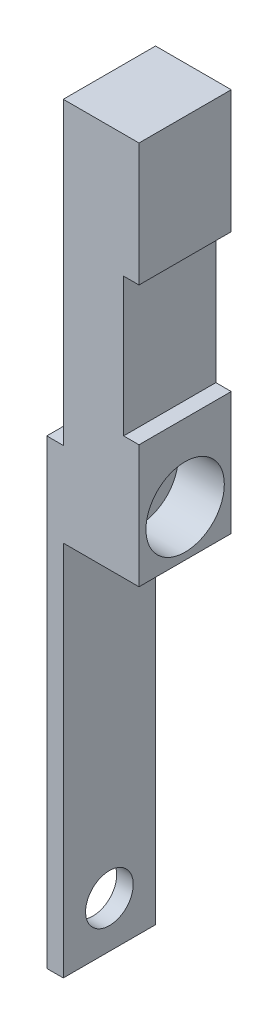
ISO-10303-21;
HEADER;
FILE_DESCRIPTION(('STEP AP214'),'2;1');
FILE_NAME('part.step','',(''),(''),'','','');
FILE_SCHEMA(('AUTOMOTIVE_DESIGN { 1 0 10303 214 1 1 1 1 }'));
ENDSEC;
DATA;
#1=APPLICATION_CONTEXT('core data for automotive mechanical design processes');
#2=APPLICATION_PROTOCOL_DEFINITION('international standard','automotive_design',2000,#1);
#3=PRODUCT_CONTEXT('',#1,'mechanical');
#4=PRODUCT('Part','Part','',(#3));
#5=PRODUCT_RELATED_PRODUCT_CATEGORY('part','',(#4));
#6=PRODUCT_DEFINITION_FORMATION('','',#4);
#7=PRODUCT_DEFINITION_CONTEXT('part definition',#1,'design');
#8=PRODUCT_DEFINITION('design','',#6,#7);
#9=PRODUCT_DEFINITION_SHAPE('','',#8);
#10=(LENGTH_UNIT() NAMED_UNIT(*) SI_UNIT(.MILLI.,.METRE.));
#11=(NAMED_UNIT(*) PLANE_ANGLE_UNIT() SI_UNIT($,.RADIAN.));
#12=(NAMED_UNIT(*) SI_UNIT($,.STERADIAN.) SOLID_ANGLE_UNIT());
#13=UNCERTAINTY_MEASURE_WITH_UNIT(LENGTH_MEASURE(1.E-05),#10,'distance_accuracy_value','');
#14=(GEOMETRIC_REPRESENTATION_CONTEXT(3) GLOBAL_UNCERTAINTY_ASSIGNED_CONTEXT((#13)) GLOBAL_UNIT_ASSIGNED_CONTEXT((#10,
#11,#12)) REPRESENTATION_CONTEXT('',''));
#15=CARTESIAN_POINT('',(0.,0.,0.));
#16=DIRECTION('',(0.,0.,1.));
#17=DIRECTION('',(1.,0.,0.));
#18=AXIS2_PLACEMENT_3D('',#15,#16,#17);
#19=CARTESIAN_POINT('',(18.25,-26.,6.));
#20=DIRECTION('',(-1.,0.,0.));
#21=DIRECTION('',(0.,0.,1.));
#22=AXIS2_PLACEMENT_3D('',#19,#20,#21);
#23=PLANE('',#22);
#24=CARTESIAN_POINT('',(18.25,-20.,0.));
#25=DIRECTION('',(1.,0.,0.));
#26=DIRECTION('',(0.,0.,-1.));
#27=AXIS2_PLACEMENT_3D('',#24,#25,#26);
#28=CIRCLE('',#27,5.1);
#29=CARTESIAN_POINT('',(18.25,-20.,-5.1));
#30=VERTEX_POINT('',#29);
#31=EDGE_CURVE('E232',#30,#30,#28,.T.);
#32=ORIENTED_EDGE('',*,*,#31,.F.);
#33=EDGE_LOOP('',(#32));
#34=FACE_BOUND('',#33,.T.);
#35=DIRECTION('',(0.,1.,0.));
#36=VECTOR('',#35,1.);
#37=CARTESIAN_POINT('',(18.25,-26.,-6.));
#38=LINE('',#37,#36);
#39=CARTESIAN_POINT('',(18.25,-26.,-6.));
#40=VERTEX_POINT('',#39);
#41=CARTESIAN_POINT('',(18.25,-10.,-6.));
#42=VERTEX_POINT('',#41);
#43=EDGE_CURVE('E158',#40,#42,#38,.T.);
#44=ORIENTED_EDGE('',*,*,#43,.T.);
#45=DIRECTION('',(0.,0.,1.));
#46=VECTOR('',#45,1.);
#47=CARTESIAN_POINT('',(18.25,-10.,6.));
#48=LINE('',#47,#46);
#49=CARTESIAN_POINT('',(18.25,-10.,6.));
#50=VERTEX_POINT('',#49);
#51=EDGE_CURVE('E211',#42,#50,#48,.T.);
#52=ORIENTED_EDGE('',*,*,#51,.T.);
#53=DIRECTION('',(0.,1.,0.));
#54=VECTOR('',#53,1.);
#55=CARTESIAN_POINT('',(18.25,-26.,6.));
#56=LINE('',#55,#54);
#57=CARTESIAN_POINT('',(18.25,-26.,6.));
#58=VERTEX_POINT('',#57);
#59=EDGE_CURVE('E129',#58,#50,#56,.T.);
#60=ORIENTED_EDGE('',*,*,#59,.F.);
#61=DIRECTION('',(0.,0.,-1.));
#62=VECTOR('',#61,1.);
#63=CARTESIAN_POINT('',(18.25,-26.,6.));
#64=LINE('',#63,#62);
#65=EDGE_CURVE('E169',#58,#40,#64,.T.);
#66=ORIENTED_EDGE('',*,*,#65,.T.);
#67=EDGE_LOOP('',(#44,#52,#60,#66));
#68=FACE_BOUND('',#67,.T.);
#69=ADVANCED_FACE('F35',(#34,#68),#23,.F.);
#70=CARTESIAN_POINT('',(6.25,-15.,6.));
#71=DIRECTION('',(1.,0.,0.));
#72=DIRECTION('',(0.,1.,0.));
#73=AXIS2_PLACEMENT_3D('',#70,#71,#72);
#74=PLANE('',#73);
#75=CARTESIAN_POINT('',(6.25,-69.,0.));
#76=DIRECTION('',(1.,0.,0.));
#77=DIRECTION('',(0.,1.,0.));
#78=AXIS2_PLACEMENT_3D('',#75,#76,#77);
#79=CIRCLE('',#78,3.1);
#80=CARTESIAN_POINT('',(6.25,-65.9,0.));
#81=VERTEX_POINT('',#80);
#82=EDGE_CURVE('E219',#81,#81,#79,.T.);
#83=ORIENTED_EDGE('',*,*,#82,.T.);
#84=EDGE_LOOP('',(#83));
#85=FACE_BOUND('',#84,.T.);
#86=CARTESIAN_POINT('',(6.25,-20.,0.));
#87=DIRECTION('',(1.,0.,0.));
#88=DIRECTION('',(0.,0.,-1.));
#89=AXIS2_PLACEMENT_3D('',#86,#87,#88);
#90=CIRCLE('',#89,3.1);
#91=CARTESIAN_POINT('',(6.25,-20.,-3.1));
#92=VERTEX_POINT('',#91);
#93=EDGE_CURVE('E229',#92,#92,#90,.T.);
#94=ORIENTED_EDGE('',*,*,#93,.T.);
#95=EDGE_LOOP('',(#94));
#96=FACE_BOUND('',#95,.T.);
#97=DIRECTION('',(0.,-1.,0.));
#98=VECTOR('',#97,1.);
#99=CARTESIAN_POINT('',(6.25,-15.,-6.));
#100=LINE('',#99,#98);
#101=CARTESIAN_POINT('',(6.25,-15.,-6.));
#102=VERTEX_POINT('',#101);
#103=CARTESIAN_POINT('',(6.25000000000001,-75.,-6.));
#104=VERTEX_POINT('',#103);
#105=EDGE_CURVE('E147',#102,#104,#100,.T.);
#106=ORIENTED_EDGE('',*,*,#105,.T.);
#107=DIRECTION('',(0.,0.,-1.));
#108=VECTOR('',#107,1.);
#109=CARTESIAN_POINT('',(6.25000000000001,-75.,6.));
#110=LINE('',#109,#108);
#111=CARTESIAN_POINT('',(6.25000000000001,-75.,6.));
#112=VERTEX_POINT('',#111);
#113=EDGE_CURVE('E43',#112,#104,#110,.T.);
#114=ORIENTED_EDGE('',*,*,#113,.F.);
#115=DIRECTION('',(0.,-1.,0.));
#116=VECTOR('',#115,1.);
#117=CARTESIAN_POINT('',(6.25,-15.,6.));
#118=LINE('',#117,#116);
#119=CARTESIAN_POINT('',(6.25,-15.,6.));
#120=VERTEX_POINT('',#119);
#121=EDGE_CURVE('E165',#120,#112,#118,.T.);
#122=ORIENTED_EDGE('',*,*,#121,.F.);
#123=DIRECTION('',(0.,0.,-1.));
#124=VECTOR('',#123,1.);
#125=CARTESIAN_POINT('',(6.25,-15.,6.));
#126=LINE('',#125,#124);
#127=EDGE_CURVE('E143',#120,#102,#126,.T.);
#128=ORIENTED_EDGE('',*,*,#127,.T.);
#129=EDGE_LOOP('',(#106,#114,#122,#128));
#130=FACE_BOUND('',#129,.T.);
#131=ADVANCED_FACE('F37',(#85,#96,#130),#74,.F.);
#132=CARTESIAN_POINT('',(6.25000000000001,-75.,6.));
#133=DIRECTION('',(0.,1.,0.));
#134=DIRECTION('',(0.,0.,1.));
#135=AXIS2_PLACEMENT_3D('',#132,#133,#134);
#136=PLANE('',#135);
#137=DIRECTION('',(1.,0.,0.));
#138=VECTOR('',#137,1.);
#139=CARTESIAN_POINT('',(6.25000000000001,-75.,-6.));
#140=LINE('',#139,#138);
#141=CARTESIAN_POINT('',(8.40000000000001,-75.,-6.));
#142=VERTEX_POINT('',#141);
#143=EDGE_CURVE('E150',#104,#142,#140,.T.);
#144=ORIENTED_EDGE('',*,*,#143,.T.);
#145=DIRECTION('',(0.,0.,-1.));
#146=VECTOR('',#145,1.);
#147=CARTESIAN_POINT('',(8.40000000000001,-75.,6.));
#148=LINE('',#147,#146);
#149=CARTESIAN_POINT('',(8.40000000000001,-75.,6.));
#150=VERTEX_POINT('',#149);
#151=EDGE_CURVE('E175',#150,#142,#148,.T.);
#152=ORIENTED_EDGE('',*,*,#151,.F.);
#153=DIRECTION('',(1.,0.,0.));
#154=VECTOR('',#153,1.);
#155=CARTESIAN_POINT('',(6.25000000000001,-75.,6.));
#156=LINE('',#155,#154);
#157=EDGE_CURVE('E101',#112,#150,#156,.T.);
#158=ORIENTED_EDGE('',*,*,#157,.F.);
#159=ORIENTED_EDGE('',*,*,#113,.T.);
#160=EDGE_LOOP('',(#144,#152,#158,#159));
#161=FACE_BOUND('',#160,.T.);
#162=ADVANCED_FACE('F178',(#161),#136,.F.);
#163=CARTESIAN_POINT('',(8.4,-26.,6.));
#164=DIRECTION('',(-1.,0.,0.));
#165=DIRECTION('',(0.,-1.,0.));
#166=AXIS2_PLACEMENT_3D('',#163,#164,#165);
#167=PLANE('',#166);
#168=CARTESIAN_POINT('',(8.40000000000001,-69.,0.));
#169=DIRECTION('',(1.,0.,0.));
#170=DIRECTION('',(0.,1.,0.));
#171=AXIS2_PLACEMENT_3D('',#168,#169,#170);
#172=CIRCLE('',#171,3.1);
#173=CARTESIAN_POINT('',(8.40000000000001,-65.9,0.));
#174=VERTEX_POINT('',#173);
#175=EDGE_CURVE('E215',#174,#174,#172,.T.);
#176=ORIENTED_EDGE('',*,*,#175,.F.);
#177=EDGE_LOOP('',(#176));
#178=FACE_BOUND('',#177,.T.);
#179=DIRECTION('',(0.,1.,0.));
#180=VECTOR('',#179,1.);
#181=CARTESIAN_POINT('',(8.4,-26.,-6.));
#182=LINE('',#181,#180);
#183=CARTESIAN_POINT('',(8.4,-26.,-6.));
#184=VERTEX_POINT('',#183);
#185=EDGE_CURVE('E153',#142,#184,#182,.T.);
#186=ORIENTED_EDGE('',*,*,#185,.T.);
#187=DIRECTION('',(0.,0.,-1.));
#188=VECTOR('',#187,1.);
#189=CARTESIAN_POINT('',(8.4,-26.,6.));
#190=LINE('',#189,#188);
#191=CARTESIAN_POINT('',(8.4,-26.,6.));
#192=VERTEX_POINT('',#191);
#193=EDGE_CURVE('E172',#192,#184,#190,.T.);
#194=ORIENTED_EDGE('',*,*,#193,.F.);
#195=DIRECTION('',(0.,1.,0.));
#196=VECTOR('',#195,1.);
#197=CARTESIAN_POINT('',(8.4,-26.,6.));
#198=LINE('',#197,#196);
#199=EDGE_CURVE('E198',#150,#192,#198,.T.);
#200=ORIENTED_EDGE('',*,*,#199,.F.);
#201=ORIENTED_EDGE('',*,*,#151,.T.);
#202=EDGE_LOOP('',(#186,#194,#200,#201));
#203=FACE_BOUND('',#202,.T.);
#204=ADVANCED_FACE('F189',(#178,#203),#167,.F.);
#205=CARTESIAN_POINT('',(8.4,-26.,6.));
#206=DIRECTION('',(0.,1.,0.));
#207=DIRECTION('',(0.,0.,1.));
#208=AXIS2_PLACEMENT_3D('',#205,#206,#207);
#209=PLANE('',#208);
#210=DIRECTION('',(1.,0.,0.));
#211=VECTOR('',#210,1.);
#212=CARTESIAN_POINT('',(8.4,-26.,-6.));
#213=LINE('',#212,#211);
#214=EDGE_CURVE('E155',#184,#40,#213,.T.);
#215=ORIENTED_EDGE('',*,*,#214,.T.);
#216=ORIENTED_EDGE('',*,*,#65,.F.);
#217=DIRECTION('',(1.,0.,0.));
#218=VECTOR('',#217,1.);
#219=CARTESIAN_POINT('',(8.4,-26.,6.));
#220=LINE('',#219,#218);
#221=EDGE_CURVE('E195',#192,#58,#220,.T.);
#222=ORIENTED_EDGE('',*,*,#221,.F.);
#223=ORIENTED_EDGE('',*,*,#193,.T.);
#224=EDGE_LOOP('',(#215,#216,#222,#223));
#225=FACE_BOUND('',#224,.T.);
#226=ADVANCED_FACE('F193',(#225),#209,.F.);
#227=CARTESIAN_POINT('',(18.25,8.,6.));
#228=VERTEX_POINT('',#227);
#229=CARTESIAN_POINT('',(18.25,24.,6.));
#230=VERTEX_POINT('',#229);
#231=EDGE_CURVE('E125',#228,#230,#56,.T.);
#232=ORIENTED_EDGE('',*,*,#231,.F.);
#233=DIRECTION('',(0.,0.,-1.));
#234=VECTOR('',#233,1.);
#235=CARTESIAN_POINT('',(18.25,8.,6.));
#236=LINE('',#235,#234);
#237=CARTESIAN_POINT('',(18.25,8.,-6.));
#238=VERTEX_POINT('',#237);
#239=EDGE_CURVE('E216',#228,#238,#236,.T.);
#240=ORIENTED_EDGE('',*,*,#239,.T.);
#241=CARTESIAN_POINT('',(18.25,24.,-6.));
#242=VERTEX_POINT('',#241);
#243=EDGE_CURVE('E157',#238,#242,#38,.T.);
#244=ORIENTED_EDGE('',*,*,#243,.T.);
#245=DIRECTION('',(0.,0.,-1.));
#246=VECTOR('',#245,1.);
#247=CARTESIAN_POINT('',(18.25,24.,6.));
#248=LINE('',#247,#246);
#249=EDGE_CURVE('E138',#230,#242,#248,.T.);
#250=ORIENTED_EDGE('',*,*,#249,.F.);
#251=EDGE_LOOP('',(#232,#240,#244,#250));
#252=FACE_BOUND('',#251,.T.);
#253=ADVANCED_FACE('F245',(#252),#23,.F.);
#254=CARTESIAN_POINT('',(8.4,24.,6.));
#255=DIRECTION('',(0.,-1.,0.));
#256=DIRECTION('',(0.,0.,-1.));
#257=AXIS2_PLACEMENT_3D('',#254,#255,#256);
#258=PLANE('',#257);
#259=DIRECTION('',(-1.,0.,0.));
#260=VECTOR('',#259,1.);
#261=CARTESIAN_POINT('',(8.4,24.,-6.));
#262=LINE('',#261,#260);
#263=CARTESIAN_POINT('',(8.4,24.,-6.));
#264=VERTEX_POINT('',#263);
#265=EDGE_CURVE('E135',#242,#264,#262,.T.);
#266=ORIENTED_EDGE('',*,*,#265,.T.);
#267=DIRECTION('',(0.,0.,-1.));
#268=VECTOR('',#267,1.);
#269=CARTESIAN_POINT('',(8.4,24.,6.));
#270=LINE('',#269,#268);
#271=CARTESIAN_POINT('',(8.4,24.,6.));
#272=VERTEX_POINT('',#271);
#273=EDGE_CURVE('E132',#272,#264,#270,.T.);
#274=ORIENTED_EDGE('',*,*,#273,.F.);
#275=DIRECTION('',(-1.,0.,0.));
#276=VECTOR('',#275,1.);
#277=CARTESIAN_POINT('',(8.4,24.,6.));
#278=LINE('',#277,#276);
#279=EDGE_CURVE('E116',#230,#272,#278,.T.);
#280=ORIENTED_EDGE('',*,*,#279,.F.);
#281=ORIENTED_EDGE('',*,*,#249,.T.);
#282=EDGE_LOOP('',(#266,#274,#280,#281));
#283=FACE_BOUND('',#282,.T.);
#284=ADVANCED_FACE('F133',(#283),#258,.F.);
#285=CARTESIAN_POINT('',(8.4,-15.,6.));
#286=DIRECTION('',(1.,0.,0.));
#287=DIRECTION('',(0.,1.,0.));
#288=AXIS2_PLACEMENT_3D('',#285,#286,#287);
#289=PLANE('',#288);
#290=DIRECTION('',(0.,-1.,0.));
#291=VECTOR('',#290,1.);
#292=CARTESIAN_POINT('',(8.4,-15.,-6.));
#293=LINE('',#292,#291);
#294=CARTESIAN_POINT('',(8.4,-15.,-6.));
#295=VERTEX_POINT('',#294);
#296=EDGE_CURVE('E162',#264,#295,#293,.T.);
#297=ORIENTED_EDGE('',*,*,#296,.T.);
#298=DIRECTION('',(0.,0.,-1.));
#299=VECTOR('',#298,1.);
#300=CARTESIAN_POINT('',(8.4,-15.,6.));
#301=LINE('',#300,#299);
#302=CARTESIAN_POINT('',(8.4,-15.,6.));
#303=VERTEX_POINT('',#302);
#304=EDGE_CURVE('E139',#303,#295,#301,.T.);
#305=ORIENTED_EDGE('',*,*,#304,.F.);
#306=DIRECTION('',(0.,-1.,0.));
#307=VECTOR('',#306,1.);
#308=CARTESIAN_POINT('',(8.4,-15.,6.));
#309=LINE('',#308,#307);
#310=EDGE_CURVE('E121',#272,#303,#309,.T.);
#311=ORIENTED_EDGE('',*,*,#310,.F.);
#312=ORIENTED_EDGE('',*,*,#273,.T.);
#313=EDGE_LOOP('',(#297,#305,#311,#312));
#314=FACE_BOUND('',#313,.T.);
#315=ADVANCED_FACE('F141',(#314),#289,.F.);
#316=CARTESIAN_POINT('',(6.25,-15.,6.));
#317=DIRECTION('',(0.,-1.,0.));
#318=DIRECTION('',(0.,0.,-1.));
#319=AXIS2_PLACEMENT_3D('',#316,#317,#318);
#320=PLANE('',#319);
#321=DIRECTION('',(-1.,0.,0.));
#322=VECTOR('',#321,1.);
#323=CARTESIAN_POINT('',(6.25,-15.,-6.));
#324=LINE('',#323,#322);
#325=EDGE_CURVE('E92',#295,#102,#324,.T.);
#326=ORIENTED_EDGE('',*,*,#325,.T.);
#327=ORIENTED_EDGE('',*,*,#127,.F.);
#328=DIRECTION('',(-1.,0.,0.));
#329=VECTOR('',#328,1.);
#330=CARTESIAN_POINT('',(6.25,-15.,6.));
#331=LINE('',#330,#329);
#332=EDGE_CURVE('E59',#303,#120,#331,.T.);
#333=ORIENTED_EDGE('',*,*,#332,.F.);
#334=ORIENTED_EDGE('',*,*,#304,.T.);
#335=EDGE_LOOP('',(#326,#327,#333,#334));
#336=FACE_BOUND('',#335,.T.);
#337=ADVANCED_FACE('F286',(#336),#320,.F.);
#338=CARTESIAN_POINT('',(0.,0.,6.));
#339=DIRECTION('',(0.,0.,1.));
#340=DIRECTION('',(1.,0.,0.));
#341=AXIS2_PLACEMENT_3D('',#338,#339,#340);
#342=PLANE('',#341);
#343=DIRECTION('',(1.,0.,0.));
#344=VECTOR('',#343,1.);
#345=CARTESIAN_POINT('',(30.0458897934668,-10.,6.));
#346=LINE('',#345,#344);
#347=CARTESIAN_POINT('',(16.25,-10.,6.));
#348=VERTEX_POINT('',#347);
#349=EDGE_CURVE('E206',#348,#50,#346,.T.);
#350=ORIENTED_EDGE('',*,*,#349,.F.);
#351=DIRECTION('',(0.,-1.,0.));
#352=VECTOR('',#351,1.);
#353=CARTESIAN_POINT('',(16.25,8.,6.));
#354=LINE('',#353,#352);
#355=CARTESIAN_POINT('',(16.25,8.,6.));
#356=VERTEX_POINT('',#355);
#357=EDGE_CURVE('E275',#356,#348,#354,.T.);
#358=ORIENTED_EDGE('',*,*,#357,.F.);
#359=DIRECTION('',(-1.,0.,0.));
#360=VECTOR('',#359,1.);
#361=CARTESIAN_POINT('',(30.0458897934668,8.,6.));
#362=LINE('',#361,#360);
#363=EDGE_CURVE('E272',#228,#356,#362,.T.);
#364=ORIENTED_EDGE('',*,*,#363,.F.);
#365=ORIENTED_EDGE('',*,*,#231,.T.);
#366=ORIENTED_EDGE('',*,*,#279,.T.);
#367=ORIENTED_EDGE('',*,*,#310,.T.);
#368=ORIENTED_EDGE('',*,*,#332,.T.);
#369=ORIENTED_EDGE('',*,*,#121,.T.);
#370=ORIENTED_EDGE('',*,*,#157,.T.);
#371=ORIENTED_EDGE('',*,*,#199,.T.);
#372=ORIENTED_EDGE('',*,*,#221,.T.);
#373=ORIENTED_EDGE('',*,*,#59,.T.);
#374=EDGE_LOOP('',(#350,#358,#364,#365,#366,#367,#368,#369,#370,#371,#372,#373));
#375=FACE_BOUND('',#374,.T.);
#376=ADVANCED_FACE('F119',(#375),#342,.T.);
#377=CARTESIAN_POINT('',(0.,0.,-6.));
#378=DIRECTION('',(0.,0.,1.));
#379=DIRECTION('',(1.,0.,0.));
#380=AXIS2_PLACEMENT_3D('',#377,#378,#379);
#381=PLANE('',#380);
#382=DIRECTION('',(0.,-1.,0.));
#383=VECTOR('',#382,1.);
#384=CARTESIAN_POINT('',(16.25,8.,-6.));
#385=LINE('',#384,#383);
#386=CARTESIAN_POINT('',(16.25,8.,-6.));
#387=VERTEX_POINT('',#386);
#388=CARTESIAN_POINT('',(16.25,-10.,-6.));
#389=VERTEX_POINT('',#388);
#390=EDGE_CURVE('E50',#387,#389,#385,.T.);
#391=ORIENTED_EDGE('',*,*,#390,.T.);
#392=DIRECTION('',(1.,0.,0.));
#393=VECTOR('',#392,1.);
#394=CARTESIAN_POINT('',(30.0458897934668,-10.,-6.));
#395=LINE('',#394,#393);
#396=EDGE_CURVE('E279',#389,#42,#395,.T.);
#397=ORIENTED_EDGE('',*,*,#396,.T.);
#398=ORIENTED_EDGE('',*,*,#43,.F.);
#399=ORIENTED_EDGE('',*,*,#214,.F.);
#400=ORIENTED_EDGE('',*,*,#185,.F.);
#401=ORIENTED_EDGE('',*,*,#143,.F.);
#402=ORIENTED_EDGE('',*,*,#105,.F.);
#403=ORIENTED_EDGE('',*,*,#325,.F.);
#404=ORIENTED_EDGE('',*,*,#296,.F.);
#405=ORIENTED_EDGE('',*,*,#265,.F.);
#406=ORIENTED_EDGE('',*,*,#243,.F.);
#407=DIRECTION('',(-1.,0.,0.));
#408=VECTOR('',#407,1.);
#409=CARTESIAN_POINT('',(0.,8.,-6.));
#410=LINE('',#409,#408);
#411=EDGE_CURVE('E11',#238,#387,#410,.T.);
#412=ORIENTED_EDGE('',*,*,#411,.T.);
#413=EDGE_LOOP('',(#391,#397,#398,#399,#400,#401,#402,#403,#404,#405,#406,#412));
#414=FACE_BOUND('',#413,.T.);
#415=ADVANCED_FACE('F183',(#414),#381,.F.);
#416=CARTESIAN_POINT('',(12.25,-20.,0.));
#417=DIRECTION('',(1.,0.,0.));
#418=DIRECTION('',(0.,0.,-1.));
#419=AXIS2_PLACEMENT_3D('',#416,#417,#418);
#420=CYLINDRICAL_SURFACE('',#419,5.1);
#421=CARTESIAN_POINT('',(12.25,-20.,0.));
#422=DIRECTION('',(1.,0.,0.));
#423=DIRECTION('',(0.,0.,-1.));
#424=AXIS2_PLACEMENT_3D('',#421,#422,#423);
#425=CIRCLE('',#424,5.1);
#426=CARTESIAN_POINT('',(12.25,-20.,-5.1));
#427=VERTEX_POINT('',#426);
#428=EDGE_CURVE('E151',#427,#427,#425,.T.);
#429=ORIENTED_EDGE('',*,*,#428,.F.);
#430=EDGE_LOOP('',(#429));
#431=FACE_BOUND('',#430,.T.);
#432=ORIENTED_EDGE('',*,*,#31,.T.);
#433=EDGE_LOOP('',(#432));
#434=FACE_BOUND('',#433,.T.);
#435=ADVANCED_FACE('F241',(#431,#434),#420,.F.);
#436=CARTESIAN_POINT('',(12.25,-20.,0.));
#437=DIRECTION('',(1.,0.,0.));
#438=DIRECTION('',(0.,0.,-1.));
#439=AXIS2_PLACEMENT_3D('',#436,#437,#438);
#440=PLANE('',#439);
#441=CARTESIAN_POINT('',(12.25,-20.,0.));
#442=DIRECTION('',(1.,0.,0.));
#443=DIRECTION('',(0.,0.,-1.));
#444=AXIS2_PLACEMENT_3D('',#441,#442,#443);
#445=CIRCLE('',#444,3.1);
#446=CARTESIAN_POINT('',(12.25,-20.,-3.1));
#447=VERTEX_POINT('',#446);
#448=EDGE_CURVE('E227',#447,#447,#445,.T.);
#449=ORIENTED_EDGE('',*,*,#448,.F.);
#450=EDGE_LOOP('',(#449));
#451=FACE_BOUND('',#450,.T.);
#452=ORIENTED_EDGE('',*,*,#428,.T.);
#453=EDGE_LOOP('',(#452));
#454=FACE_BOUND('',#453,.T.);
#455=ADVANCED_FACE('F300',(#451,#454),#440,.T.);
#456=CARTESIAN_POINT('',(6.25,-20.,0.));
#457=DIRECTION('',(1.,0.,0.));
#458=DIRECTION('',(0.,0.,-1.));
#459=AXIS2_PLACEMENT_3D('',#456,#457,#458);
#460=CYLINDRICAL_SURFACE('',#459,3.1);
#461=ORIENTED_EDGE('',*,*,#93,.F.);
#462=EDGE_LOOP('',(#461));
#463=FACE_BOUND('',#462,.T.);
#464=ORIENTED_EDGE('',*,*,#448,.T.);
#465=EDGE_LOOP('',(#464));
#466=FACE_BOUND('',#465,.T.);
#467=ADVANCED_FACE('F304',(#463,#466),#460,.F.);
#468=CARTESIAN_POINT('',(6.25,-69.,0.));
#469=DIRECTION('',(1.,0.,0.));
#470=DIRECTION('',(0.,1.,0.));
#471=AXIS2_PLACEMENT_3D('',#468,#469,#470);
#472=CYLINDRICAL_SURFACE('',#471,3.1);
#473=CARTESIAN_POINT('',(6.25,-65.9,0.));
#474=CARTESIAN_POINT('',(6.27239583333333,-65.9,0.));
#475=CARTESIAN_POINT('',(6.29479166666667,-65.9,0.));
#476=CARTESIAN_POINT('',(6.33958333333333,-65.9,0.));
#477=CARTESIAN_POINT('',(6.36197916666667,-65.9,0.));
#478=CARTESIAN_POINT('',(6.40677083333333,-65.9,0.));
#479=CARTESIAN_POINT('',(6.42916666666667,-65.9,0.));
#480=CARTESIAN_POINT('',(6.47395833333333,-65.9,0.));
#481=CARTESIAN_POINT('',(6.49635416666667,-65.9,0.));
#482=CARTESIAN_POINT('',(6.54114583333333,-65.9,0.));
#483=CARTESIAN_POINT('',(6.56354166666667,-65.9,0.));
#484=CARTESIAN_POINT('',(6.60833333333333,-65.9,0.));
#485=CARTESIAN_POINT('',(6.63072916666667,-65.9,0.));
#486=CARTESIAN_POINT('',(6.67552083333333,-65.9,0.));
#487=CARTESIAN_POINT('',(6.69791666666667,-65.9,0.));
#488=CARTESIAN_POINT('',(6.74270833333333,-65.9,0.));
#489=CARTESIAN_POINT('',(6.76510416666667,-65.9,0.));
#490=CARTESIAN_POINT('',(6.80989583333333,-65.9,0.));
#491=CARTESIAN_POINT('',(6.83229166666667,-65.9,0.));
#492=CARTESIAN_POINT('',(6.87708333333333,-65.9,0.));
#493=CARTESIAN_POINT('',(6.89947916666667,-65.9,0.));
#494=CARTESIAN_POINT('',(6.94427083333333,-65.9,0.));
#495=CARTESIAN_POINT('',(6.96666666666667,-65.9,0.));
#496=CARTESIAN_POINT('',(7.01145833333333,-65.9,0.));
#497=CARTESIAN_POINT('',(7.03385416666667,-65.9,0.));
#498=CARTESIAN_POINT('',(7.07864583333334,-65.9,0.));
#499=CARTESIAN_POINT('',(7.10104166666667,-65.9,0.));
#500=CARTESIAN_POINT('',(7.14583333333333,-65.9,0.));
#501=CARTESIAN_POINT('',(7.16822916666667,-65.9,0.));
#502=CARTESIAN_POINT('',(7.21302083333333,-65.9,0.));
#503=CARTESIAN_POINT('',(7.23541666666667,-65.9,0.));
#504=CARTESIAN_POINT('',(7.28020833333334,-65.9,0.));
#505=CARTESIAN_POINT('',(7.30260416666667,-65.9,0.));
#506=CARTESIAN_POINT('',(7.34739583333334,-65.9,0.));
#507=CARTESIAN_POINT('',(7.36979166666667,-65.9,0.));
#508=CARTESIAN_POINT('',(7.41458333333334,-65.9,0.));
#509=CARTESIAN_POINT('',(7.43697916666667,-65.9,0.));
#510=CARTESIAN_POINT('',(7.48177083333334,-65.9,0.));
#511=CARTESIAN_POINT('',(7.50416666666667,-65.9,0.));
#512=CARTESIAN_POINT('',(7.54895833333334,-65.9,0.));
#513=CARTESIAN_POINT('',(7.57135416666667,-65.9,0.));
#514=CARTESIAN_POINT('',(7.61614583333334,-65.9,0.));
#515=CARTESIAN_POINT('',(7.63854166666667,-65.9,0.));
#516=CARTESIAN_POINT('',(7.68333333333334,-65.9,0.));
#517=CARTESIAN_POINT('',(7.70572916666667,-65.9,0.));
#518=CARTESIAN_POINT('',(7.75052083333334,-65.9,0.));
#519=CARTESIAN_POINT('',(7.77291666666667,-65.9,0.));
#520=CARTESIAN_POINT('',(7.81770833333334,-65.9,0.));
#521=CARTESIAN_POINT('',(7.84010416666667,-65.9,0.));
#522=CARTESIAN_POINT('',(7.88489583333334,-65.9,0.));
#523=CARTESIAN_POINT('',(7.90729166666667,-65.9,0.));
#524=CARTESIAN_POINT('',(7.95208333333334,-65.9,0.));
#525=CARTESIAN_POINT('',(7.97447916666667,-65.9,0.));
#526=CARTESIAN_POINT('',(8.01927083333334,-65.9,0.));
#527=CARTESIAN_POINT('',(8.04166666666667,-65.9,0.));
#528=CARTESIAN_POINT('',(8.08645833333334,-65.9,0.));
#529=CARTESIAN_POINT('',(8.10885416666667,-65.9,0.));
#530=CARTESIAN_POINT('',(8.15364583333334,-65.9,0.));
#531=CARTESIAN_POINT('',(8.17604166666667,-65.9,0.));
#532=CARTESIAN_POINT('',(8.22083333333334,-65.9,0.));
#533=CARTESIAN_POINT('',(8.24322916666667,-65.9,0.));
#534=CARTESIAN_POINT('',(8.28802083333334,-65.9,0.));
#535=CARTESIAN_POINT('',(8.31041666666667,-65.9,0.));
#536=CARTESIAN_POINT('',(8.35520833333334,-65.9,0.));
#537=CARTESIAN_POINT('',(8.37760416666667,-65.9,0.));
#538=CARTESIAN_POINT('',(8.40000000000001,-65.9,0.));
#539=B_SPLINE_CURVE_WITH_KNOTS('',3,(#473,#474,#475,#476,#477,#478,#479,#480,#481,#482,#483,
#484,#485,#486,#487,#488,#489,#490,#491,#492,#493,#494,#495,#496,#497,#498,#499,#500,#501,#502,
#503,#504,#505,#506,#507,#508,#509,#510,#511,#512,#513,#514,#515,#516,#517,#518,#519,#520,#521,
#522,#523,#524,#525,#526,#527,#528,#529,#530,#531,#532,#533,#534,#535,#536,#537,#538),
.UNSPECIFIED.,.F.,.F.,(4,2,2,2,2,2,2,2,2,2,2,2,2,2,2,2,2,2,2,2,2,2,2,2,2,2,2,2,2,2,2,2,4),(0.,
0.0671875000000004,0.134375000000001,0.201562500000001,0.268750000000002,0.335937500000002,
0.403125000000002,0.470312500000002,0.537500000000002,0.604687500000003,0.671875000000003,
0.739062500000004,0.806250000000004,0.873437500000004,0.940625000000004,1.0078125,1.075,
1.14218750000001,1.20937500000001,1.27656250000001,1.34375000000001,1.41093750000001,
1.47812500000001,1.54531250000001,1.61250000000001,1.67968750000001,1.74687500000001,
1.81406250000001,1.88125000000001,1.94843750000001,2.01562500000001,2.08281250000001,
2.15000000000001),.UNSPECIFIED.);
#540=EDGE_CURVE('BSEAM308',#81,#174,#539,.T.);
#541=ORIENTED_EDGE('',*,*,#82,.F.);
#542=ORIENTED_EDGE('',*,*,#175,.T.);
#543=ORIENTED_EDGE('',*,*,#540,.T.);
#544=ORIENTED_EDGE('',*,*,#540,.F.);
#545=EDGE_LOOP('',(#541,#543,#542,#544));
#546=FACE_BOUND('',#545,.T.);
#547=ADVANCED_FACE('F308',(#546),#472,.F.);
#548=CARTESIAN_POINT('',(30.0458897934668,-10.,-6.));
#549=DIRECTION('',(0.,-1.,0.));
#550=DIRECTION('',(1.,0.,0.));
#551=AXIS2_PLACEMENT_3D('',#548,#549,#550);
#552=PLANE('',#551);
#553=ORIENTED_EDGE('',*,*,#396,.F.);
#554=DIRECTION('',(0.,0.,1.));
#555=VECTOR('',#554,1.);
#556=CARTESIAN_POINT('',(16.25,-10.,-6.));
#557=LINE('',#556,#555);
#558=EDGE_CURVE('E222',#389,#348,#557,.T.);
#559=ORIENTED_EDGE('',*,*,#558,.T.);
#560=ORIENTED_EDGE('',*,*,#349,.T.);
#561=ORIENTED_EDGE('',*,*,#51,.F.);
#562=EDGE_LOOP('',(#553,#559,#560,#561));
#563=FACE_BOUND('',#562,.T.);
#564=ADVANCED_FACE('F285',(#563),#552,.F.);
#565=CARTESIAN_POINT('',(30.0458897934668,8.,-6.));
#566=DIRECTION('',(0.,1.,0.));
#567=DIRECTION('',(-1.,0.,0.));
#568=AXIS2_PLACEMENT_3D('',#565,#566,#567);
#569=PLANE('',#568);
#570=ORIENTED_EDGE('',*,*,#363,.T.);
#571=DIRECTION('',(0.,0.,1.));
#572=VECTOR('',#571,1.);
#573=CARTESIAN_POINT('',(16.25,8.,-6.));
#574=LINE('',#573,#572);
#575=EDGE_CURVE('E274',#387,#356,#574,.T.);
#576=ORIENTED_EDGE('',*,*,#575,.F.);
#577=ORIENTED_EDGE('',*,*,#411,.F.);
#578=ORIENTED_EDGE('',*,*,#239,.F.);
#579=EDGE_LOOP('',(#570,#576,#577,#578));
#580=FACE_BOUND('',#579,.T.);
#581=ADVANCED_FACE('F273',(#580),#569,.F.);
#582=CARTESIAN_POINT('',(16.25,8.,-6.));
#583=DIRECTION('',(-1.,0.,0.));
#584=DIRECTION('',(0.,0.,1.));
#585=AXIS2_PLACEMENT_3D('',#582,#583,#584);
#586=PLANE('',#585);
#587=ORIENTED_EDGE('',*,*,#558,.F.);
#588=ORIENTED_EDGE('',*,*,#390,.F.);
#589=ORIENTED_EDGE('',*,*,#575,.T.);
#590=ORIENTED_EDGE('',*,*,#357,.T.);
#591=EDGE_LOOP('',(#587,#588,#589,#590));
#592=FACE_BOUND('',#591,.T.);
#593=ADVANCED_FACE('F278',(#592),#586,.F.);
#594=CLOSED_SHELL('',(#69,#131,#162,#204,#226,#253,#284,#315,#337,#376,#415,#435,#455,#467,#547,
#564,#581,#593));
#595=MANIFOLD_SOLID_BREP('B2',#594);
#596=ADVANCED_BREP_SHAPE_REPRESENTATION('',(#18,#595),#14);
#597=SHAPE_DEFINITION_REPRESENTATION(#9,#596);
ENDSEC;
END-ISO-10303-21;
